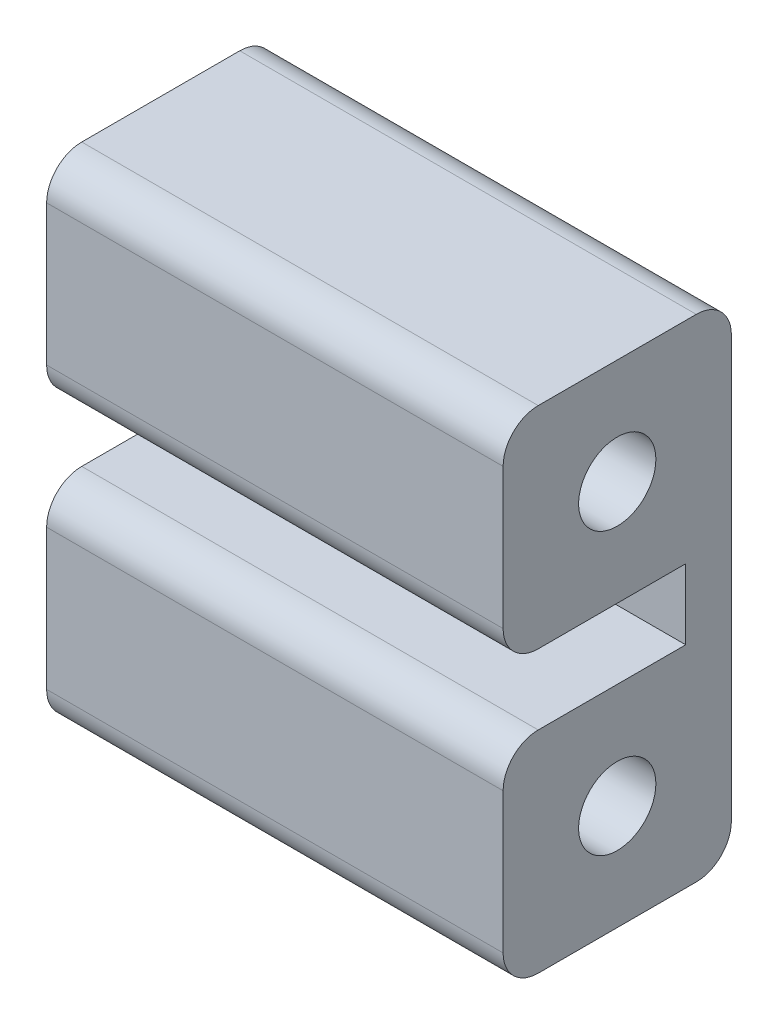
ISO-10303-21;
HEADER;
FILE_DESCRIPTION(('STEP AP214'),'2;1');
FILE_NAME('part.step','',(''),(''),'','','');
FILE_SCHEMA(('AUTOMOTIVE_DESIGN { 1 0 10303 214 1 1 1 1 }'));
ENDSEC;
DATA;
#1=APPLICATION_CONTEXT('core data for automotive mechanical design processes');
#2=APPLICATION_PROTOCOL_DEFINITION('international standard','automotive_design',2000,#1);
#3=PRODUCT_CONTEXT('',#1,'mechanical');
#4=PRODUCT('Part','Part','',(#3));
#5=PRODUCT_RELATED_PRODUCT_CATEGORY('part','',(#4));
#6=PRODUCT_DEFINITION_FORMATION('','',#4);
#7=PRODUCT_DEFINITION_CONTEXT('part definition',#1,'design');
#8=PRODUCT_DEFINITION('design','',#6,#7);
#9=PRODUCT_DEFINITION_SHAPE('','',#8);
#10=(LENGTH_UNIT() NAMED_UNIT(*) SI_UNIT(.MILLI.,.METRE.));
#11=(NAMED_UNIT(*) PLANE_ANGLE_UNIT() SI_UNIT($,.RADIAN.));
#12=(NAMED_UNIT(*) SI_UNIT($,.STERADIAN.) SOLID_ANGLE_UNIT());
#13=UNCERTAINTY_MEASURE_WITH_UNIT(LENGTH_MEASURE(1.E-05),#10,'distance_accuracy_value','');
#14=(GEOMETRIC_REPRESENTATION_CONTEXT(3) GLOBAL_UNCERTAINTY_ASSIGNED_CONTEXT((#13)) GLOBAL_UNIT_ASSIGNED_CONTEXT((#10,
#11,#12)) REPRESENTATION_CONTEXT('',''));
#15=CARTESIAN_POINT('',(0.,0.,0.));
#16=DIRECTION('',(0.,0.,1.));
#17=DIRECTION('',(1.,0.,0.));
#18=AXIS2_PLACEMENT_3D('',#15,#16,#17);
#19=CARTESIAN_POINT('',(-13.,1.,0.));
#20=DIRECTION('',(0.,-1.,0.));
#21=DIRECTION('',(0.,0.,-1.));
#22=AXIS2_PLACEMENT_3D('',#19,#20,#21);
#23=PLANE('',#22);
#24=DIRECTION('',(0.,0.,-1.));
#25=VECTOR('',#24,1.);
#26=CARTESIAN_POINT('',(0.,1.,0.));
#27=LINE('',#26,#25);
#28=CARTESIAN_POINT('',(0.,1.,2.25));
#29=VERTEX_POINT('',#28);
#30=CARTESIAN_POINT('',(0.,1.,-1.95));
#31=VERTEX_POINT('',#30);
#32=EDGE_CURVE('E183',#29,#31,#27,.T.);
#33=ORIENTED_EDGE('',*,*,#32,.F.);
#34=DIRECTION('',(1.,0.,0.));
#35=VECTOR('',#34,1.);
#36=CARTESIAN_POINT('',(-13.,1.,2.25));
#37=LINE('',#36,#35);
#38=CARTESIAN_POINT('',(-13.,1.,2.25));
#39=VERTEX_POINT('',#38);
#40=EDGE_CURVE('E44',#29,#39,#37,.F.);
#41=ORIENTED_EDGE('',*,*,#40,.T.);
#42=DIRECTION('',(0.,0.,-1.));
#43=VECTOR('',#42,1.);
#44=CARTESIAN_POINT('',(-13.,1.,0.));
#45=LINE('',#44,#43);
#46=CARTESIAN_POINT('',(-13.,1.,-1.95));
#47=VERTEX_POINT('',#46);
#48=EDGE_CURVE('E138',#39,#47,#45,.T.);
#49=ORIENTED_EDGE('',*,*,#48,.T.);
#50=DIRECTION('',(1.,0.,0.));
#51=VECTOR('',#50,1.);
#52=CARTESIAN_POINT('',(-13.,1.,-1.95));
#53=LINE('',#52,#51);
#54=EDGE_CURVE('E141',#47,#31,#53,.T.);
#55=ORIENTED_EDGE('',*,*,#54,.T.);
#56=EDGE_LOOP('',(#33,#41,#49,#55));
#57=FACE_BOUND('',#56,.T.);
#58=ADVANCED_FACE('F36',(#57),#23,.T.);
#59=CARTESIAN_POINT('',(-13.,0.,3.25));
#60=DIRECTION('',(0.,0.,1.));
#61=DIRECTION('',(1.,0.,0.));
#62=AXIS2_PLACEMENT_3D('',#59,#60,#61);
#63=PLANE('',#62);
#64=DIRECTION('',(0.,-1.,0.));
#65=VECTOR('',#64,1.);
#66=CARTESIAN_POINT('',(0.,0.,3.25));
#67=LINE('',#66,#65);
#68=CARTESIAN_POINT('',(0.,6.,3.25));
#69=VERTEX_POINT('',#68);
#70=CARTESIAN_POINT('',(0.,2.,3.25));
#71=VERTEX_POINT('',#70);
#72=EDGE_CURVE('E189',#69,#71,#67,.T.);
#73=ORIENTED_EDGE('',*,*,#72,.F.);
#74=DIRECTION('',(1.,0.,0.));
#75=VECTOR('',#74,1.);
#76=CARTESIAN_POINT('',(-13.,6.,3.25));
#77=LINE('',#76,#75);
#78=CARTESIAN_POINT('',(-13.,6.,3.25));
#79=VERTEX_POINT('',#78);
#80=EDGE_CURVE('E227',#69,#79,#77,.F.);
#81=ORIENTED_EDGE('',*,*,#80,.T.);
#82=DIRECTION('',(0.,-1.,0.));
#83=VECTOR('',#82,1.);
#84=CARTESIAN_POINT('',(-13.,0.,3.25));
#85=LINE('',#84,#83);
#86=CARTESIAN_POINT('',(-13.,2.,3.25));
#87=VERTEX_POINT('',#86);
#88=EDGE_CURVE('E169',#79,#87,#85,.T.);
#89=ORIENTED_EDGE('',*,*,#88,.T.);
#90=DIRECTION('',(1.,0.,0.));
#91=VECTOR('',#90,1.);
#92=CARTESIAN_POINT('',(-13.,2.,3.25));
#93=LINE('',#92,#91);
#94=EDGE_CURVE('E224',#87,#71,#93,.T.);
#95=ORIENTED_EDGE('',*,*,#94,.T.);
#96=EDGE_LOOP('',(#73,#81,#89,#95));
#97=FACE_BOUND('',#96,.T.);
#98=ADVANCED_FACE('F277',(#97),#63,.T.);
#99=CARTESIAN_POINT('',(-13.,7.,0.));
#100=DIRECTION('',(0.,-1.,0.));
#101=DIRECTION('',(0.,0.,-1.));
#102=AXIS2_PLACEMENT_3D('',#99,#100,#101);
#103=PLANE('',#102);
#104=DIRECTION('',(0.,0.,-1.));
#105=VECTOR('',#104,1.);
#106=CARTESIAN_POINT('',(-13.,7.,0.));
#107=LINE('',#106,#105);
#108=CARTESIAN_POINT('',(-13.,7.,2.25));
#109=VERTEX_POINT('',#108);
#110=CARTESIAN_POINT('',(-13.,7.,-2.25));
#111=VERTEX_POINT('',#110);
#112=EDGE_CURVE('E175',#109,#111,#107,.T.);
#113=ORIENTED_EDGE('',*,*,#112,.F.);
#114=DIRECTION('',(1.,0.,0.));
#115=VECTOR('',#114,1.);
#116=CARTESIAN_POINT('',(0.,7.,2.25));
#117=LINE('',#116,#115);
#118=CARTESIAN_POINT('',(0.,7.,2.25));
#119=VERTEX_POINT('',#118);
#120=EDGE_CURVE('E209',#109,#119,#117,.T.);
#121=ORIENTED_EDGE('',*,*,#120,.T.);
#122=DIRECTION('',(0.,0.,-1.));
#123=VECTOR('',#122,1.);
#124=CARTESIAN_POINT('',(0.,7.,0.));
#125=LINE('',#124,#123);
#126=CARTESIAN_POINT('',(0.,7.,-2.25));
#127=VERTEX_POINT('',#126);
#128=EDGE_CURVE('E193',#119,#127,#125,.T.);
#129=ORIENTED_EDGE('',*,*,#128,.T.);
#130=DIRECTION('',(1.,0.,0.));
#131=VECTOR('',#130,1.);
#132=CARTESIAN_POINT('',(-13.,7.,-2.25));
#133=LINE('',#132,#131);
#134=EDGE_CURVE('E206',#127,#111,#133,.F.);
#135=ORIENTED_EDGE('',*,*,#134,.T.);
#136=EDGE_LOOP('',(#113,#121,#129,#135));
#137=FACE_BOUND('',#136,.T.);
#138=ADVANCED_FACE('F285',(#137),#103,.F.);
#139=CARTESIAN_POINT('',(-13.,0.,-3.25));
#140=DIRECTION('',(0.,0.,1.));
#141=DIRECTION('',(0.,-1.,0.));
#142=AXIS2_PLACEMENT_3D('',#139,#140,#141);
#143=PLANE('',#142);
#144=DIRECTION('',(0.,-1.,0.));
#145=VECTOR('',#144,1.);
#146=CARTESIAN_POINT('',(-13.,0.,-3.25));
#147=LINE('',#146,#145);
#148=CARTESIAN_POINT('',(-13.,6.,-3.25));
#149=VERTEX_POINT('',#148);
#150=CARTESIAN_POINT('',(-13.,-6.,-3.25));
#151=VERTEX_POINT('',#150);
#152=EDGE_CURVE('E172',#149,#151,#147,.T.);
#153=ORIENTED_EDGE('',*,*,#152,.F.);
#154=DIRECTION('',(1.,0.,0.));
#155=VECTOR('',#154,1.);
#156=CARTESIAN_POINT('',(-13.,6.,-3.25));
#157=LINE('',#156,#155);
#158=CARTESIAN_POINT('',(0.,6.,-3.25));
#159=VERTEX_POINT('',#158);
#160=EDGE_CURVE('E241',#149,#159,#157,.T.);
#161=ORIENTED_EDGE('',*,*,#160,.T.);
#162=DIRECTION('',(0.,-1.,0.));
#163=VECTOR('',#162,1.);
#164=CARTESIAN_POINT('',(0.,0.,-3.25));
#165=LINE('',#164,#163);
#166=CARTESIAN_POINT('',(0.,-6.,-3.25));
#167=VERTEX_POINT('',#166);
#168=EDGE_CURVE('E197',#159,#167,#165,.T.);
#169=ORIENTED_EDGE('',*,*,#168,.T.);
#170=DIRECTION('',(1.,0.,0.));
#171=VECTOR('',#170,1.);
#172=CARTESIAN_POINT('',(-13.,-6.,-3.25));
#173=LINE('',#172,#171);
#174=EDGE_CURVE('E239',#167,#151,#173,.F.);
#175=ORIENTED_EDGE('',*,*,#174,.T.);
#176=EDGE_LOOP('',(#153,#161,#169,#175));
#177=FACE_BOUND('',#176,.T.);
#178=ADVANCED_FACE('F293',(#177),#143,.F.);
#179=CARTESIAN_POINT('',(-13.,-7.,0.));
#180=DIRECTION('',(0.,-1.,0.));
#181=DIRECTION('',(0.,0.,-1.));
#182=AXIS2_PLACEMENT_3D('',#179,#180,#181);
#183=PLANE('',#182);
#184=DIRECTION('',(0.,0.,-1.));
#185=VECTOR('',#184,1.);
#186=CARTESIAN_POINT('',(-13.,-7.,0.));
#187=LINE('',#186,#185);
#188=CARTESIAN_POINT('',(-13.,-7.,2.25));
#189=VERTEX_POINT('',#188);
#190=CARTESIAN_POINT('',(-13.,-7.,-2.25));
#191=VERTEX_POINT('',#190);
#192=EDGE_CURVE('E168',#189,#191,#187,.T.);
#193=ORIENTED_EDGE('',*,*,#192,.T.);
#194=DIRECTION('',(1.,0.,0.));
#195=VECTOR('',#194,1.);
#196=CARTESIAN_POINT('',(0.,-7.,-2.25));
#197=LINE('',#196,#195);
#198=CARTESIAN_POINT('',(0.,-7.,-2.25));
#199=VERTEX_POINT('',#198);
#200=EDGE_CURVE('E246',#191,#199,#197,.T.);
#201=ORIENTED_EDGE('',*,*,#200,.T.);
#202=DIRECTION('',(0.,0.,-1.));
#203=VECTOR('',#202,1.);
#204=CARTESIAN_POINT('',(0.,-7.,0.));
#205=LINE('',#204,#203);
#206=CARTESIAN_POINT('',(0.,-7.,2.25));
#207=VERTEX_POINT('',#206);
#208=EDGE_CURVE('E194',#207,#199,#205,.T.);
#209=ORIENTED_EDGE('',*,*,#208,.F.);
#210=DIRECTION('',(1.,0.,0.));
#211=VECTOR('',#210,1.);
#212=CARTESIAN_POINT('',(-13.,-7.,2.25));
#213=LINE('',#212,#211);
#214=EDGE_CURVE('E244',#207,#189,#213,.F.);
#215=ORIENTED_EDGE('',*,*,#214,.T.);
#216=EDGE_LOOP('',(#193,#201,#209,#215));
#217=FACE_BOUND('',#216,.T.);
#218=ADVANCED_FACE('F300',(#217),#183,.T.);
#219=CARTESIAN_POINT('',(-13.,-2.,3.25));
#220=VERTEX_POINT('',#219);
#221=CARTESIAN_POINT('',(-13.,-6.,3.25));
#222=VERTEX_POINT('',#221);
#223=EDGE_CURVE('E164',#220,#222,#85,.T.);
#224=ORIENTED_EDGE('',*,*,#223,.T.);
#225=DIRECTION('',(1.,0.,0.));
#226=VECTOR('',#225,1.);
#227=CARTESIAN_POINT('',(-13.,-6.,3.25));
#228=LINE('',#227,#226);
#229=CARTESIAN_POINT('',(0.,-6.,3.25));
#230=VERTEX_POINT('',#229);
#231=EDGE_CURVE('E251',#222,#230,#228,.T.);
#232=ORIENTED_EDGE('',*,*,#231,.T.);
#233=CARTESIAN_POINT('',(0.,-2.,3.25));
#234=VERTEX_POINT('',#233);
#235=EDGE_CURVE('E188',#234,#230,#67,.T.);
#236=ORIENTED_EDGE('',*,*,#235,.F.);
#237=DIRECTION('',(1.,0.,0.));
#238=VECTOR('',#237,1.);
#239=CARTESIAN_POINT('',(-13.,-2.,3.25));
#240=LINE('',#239,#238);
#241=EDGE_CURVE('E249',#234,#220,#240,.F.);
#242=ORIENTED_EDGE('',*,*,#241,.T.);
#243=EDGE_LOOP('',(#224,#232,#236,#242));
#244=FACE_BOUND('',#243,.T.);
#245=ADVANCED_FACE('F257',(#244),#63,.T.);
#246=CARTESIAN_POINT('',(-13.,-1.,0.));
#247=DIRECTION('',(0.,-1.,0.));
#248=DIRECTION('',(0.,0.,-1.));
#249=AXIS2_PLACEMENT_3D('',#246,#247,#248);
#250=PLANE('',#249);
#251=DIRECTION('',(0.,0.,-1.));
#252=VECTOR('',#251,1.);
#253=CARTESIAN_POINT('',(-13.,-1.,0.));
#254=LINE('',#253,#252);
#255=CARTESIAN_POINT('',(-13.,-1.,2.25));
#256=VERTEX_POINT('',#255);
#257=CARTESIAN_POINT('',(-13.,-1.,-1.95));
#258=VERTEX_POINT('',#257);
#259=EDGE_CURVE('E161',#256,#258,#254,.T.);
#260=ORIENTED_EDGE('',*,*,#259,.F.);
#261=DIRECTION('',(1.,0.,0.));
#262=VECTOR('',#261,1.);
#263=CARTESIAN_POINT('',(0.,-1.,2.25));
#264=LINE('',#263,#262);
#265=CARTESIAN_POINT('',(0.,-1.,2.25));
#266=VERTEX_POINT('',#265);
#267=EDGE_CURVE('E11',#256,#266,#264,.T.);
#268=ORIENTED_EDGE('',*,*,#267,.T.);
#269=DIRECTION('',(0.,0.,-1.));
#270=VECTOR('',#269,1.);
#271=CARTESIAN_POINT('',(0.,-1.,0.));
#272=LINE('',#271,#270);
#273=CARTESIAN_POINT('',(0.,-1.,-1.95));
#274=VERTEX_POINT('',#273);
#275=EDGE_CURVE('E186',#266,#274,#272,.T.);
#276=ORIENTED_EDGE('',*,*,#275,.T.);
#277=DIRECTION('',(1.,0.,0.));
#278=VECTOR('',#277,1.);
#279=CARTESIAN_POINT('',(-13.,-1.,-1.95));
#280=LINE('',#279,#278);
#281=EDGE_CURVE('E155',#258,#274,#280,.T.);
#282=ORIENTED_EDGE('',*,*,#281,.F.);
#283=EDGE_LOOP('',(#260,#268,#276,#282));
#284=FACE_BOUND('',#283,.T.);
#285=ADVANCED_FACE('F269',(#284),#250,.F.);
#286=CARTESIAN_POINT('',(-13.,4.,0.));
#287=DIRECTION('',(1.,0.,0.));
#288=DIRECTION('',(0.,0.,-1.));
#289=AXIS2_PLACEMENT_3D('',#286,#287,#288);
#290=CYLINDRICAL_SURFACE('',#289,1.1);
#291=CARTESIAN_POINT('',(-13.,4.,0.));
#292=DIRECTION('',(1.,0.,0.));
#293=DIRECTION('',(0.,0.,-1.));
#294=AXIS2_PLACEMENT_3D('',#291,#292,#293);
#295=CIRCLE('',#294,1.1);
#296=CARTESIAN_POINT('',(-13.,4.,-1.1));
#297=VERTEX_POINT('',#296);
#298=EDGE_CURVE('E178',#297,#297,#295,.T.);
#299=ORIENTED_EDGE('',*,*,#298,.F.);
#300=EDGE_LOOP('',(#299));
#301=FACE_BOUND('',#300,.T.);
#302=CARTESIAN_POINT('',(0.,4.,0.));
#303=DIRECTION('',(1.,0.,0.));
#304=DIRECTION('',(0.,0.,-1.));
#305=AXIS2_PLACEMENT_3D('',#302,#303,#304);
#306=CIRCLE('',#305,1.1);
#307=CARTESIAN_POINT('',(0.,4.,-1.1));
#308=VERTEX_POINT('',#307);
#309=EDGE_CURVE('E192',#308,#308,#306,.T.);
#310=ORIENTED_EDGE('',*,*,#309,.T.);
#311=EDGE_LOOP('',(#310));
#312=FACE_BOUND('',#311,.T.);
#313=ADVANCED_FACE('F387',(#301,#312),#290,.F.);
#314=CARTESIAN_POINT('',(-13.,0.,-1.95));
#315=DIRECTION('',(0.,0.,1.));
#316=DIRECTION('',(1.,0.,0.));
#317=AXIS2_PLACEMENT_3D('',#314,#315,#316);
#318=PLANE('',#317);
#319=DIRECTION('',(0.,-1.,0.));
#320=VECTOR('',#319,1.);
#321=CARTESIAN_POINT('',(0.,0.,-1.95));
#322=LINE('',#321,#320);
#323=EDGE_CURVE('E154',#31,#274,#322,.T.);
#324=ORIENTED_EDGE('',*,*,#323,.F.);
#325=ORIENTED_EDGE('',*,*,#54,.F.);
#326=DIRECTION('',(0.,-1.,0.));
#327=VECTOR('',#326,1.);
#328=CARTESIAN_POINT('',(-13.,0.,-1.95));
#329=LINE('',#328,#327);
#330=EDGE_CURVE('E146',#47,#258,#329,.T.);
#331=ORIENTED_EDGE('',*,*,#330,.T.);
#332=ORIENTED_EDGE('',*,*,#281,.T.);
#333=EDGE_LOOP('',(#324,#325,#331,#332));
#334=FACE_BOUND('',#333,.T.);
#335=ADVANCED_FACE('F151',(#334),#318,.T.);
#336=CARTESIAN_POINT('',(-13.,-4.,0.));
#337=DIRECTION('',(1.,0.,0.));
#338=DIRECTION('',(0.,0.,-1.));
#339=AXIS2_PLACEMENT_3D('',#336,#337,#338);
#340=CYLINDRICAL_SURFACE('',#339,1.1);
#341=CARTESIAN_POINT('',(-13.,-4.,0.));
#342=DIRECTION('',(1.,0.,0.));
#343=DIRECTION('',(0.,0.,-1.));
#344=AXIS2_PLACEMENT_3D('',#341,#342,#343);
#345=CIRCLE('',#344,1.1);
#346=CARTESIAN_POINT('',(-13.,-4.,-1.1));
#347=VERTEX_POINT('',#346);
#348=EDGE_CURVE('E156',#347,#347,#345,.F.);
#349=ORIENTED_EDGE('',*,*,#348,.T.);
#350=EDGE_LOOP('',(#349));
#351=FACE_BOUND('',#350,.T.);
#352=CARTESIAN_POINT('',(0.,-4.,0.));
#353=DIRECTION('',(1.,0.,0.));
#354=DIRECTION('',(0.,0.,-1.));
#355=AXIS2_PLACEMENT_3D('',#352,#353,#354);
#356=CIRCLE('',#355,1.1);
#357=CARTESIAN_POINT('',(0.,-4.,-1.1));
#358=VERTEX_POINT('',#357);
#359=EDGE_CURVE('E147',#358,#358,#356,.F.);
#360=ORIENTED_EDGE('',*,*,#359,.F.);
#361=EDGE_LOOP('',(#360));
#362=FACE_BOUND('',#361,.T.);
#363=ADVANCED_FACE('F370',(#351,#362),#340,.F.);
#364=CARTESIAN_POINT('',(-13.,0.,0.));
#365=DIRECTION('',(1.,0.,0.));
#366=DIRECTION('',(0.,0.,-1.));
#367=AXIS2_PLACEMENT_3D('',#364,#365,#366);
#368=PLANE('',#367);
#369=ORIENTED_EDGE('',*,*,#88,.F.);
#370=CARTESIAN_POINT('',(-13.,6.,2.25));
#371=DIRECTION('',(1.,0.,0.));
#372=DIRECTION('',(0.,0.,-1.));
#373=AXIS2_PLACEMENT_3D('',#370,#371,#372);
#374=CIRCLE('',#373,1.);
#375=EDGE_CURVE('E237',#79,#109,#374,.F.);
#376=ORIENTED_EDGE('',*,*,#375,.T.);
#377=ORIENTED_EDGE('',*,*,#112,.T.);
#378=CARTESIAN_POINT('',(-13.,6.,-2.25));
#379=DIRECTION('',(1.,0.,0.));
#380=DIRECTION('',(0.,0.,-1.));
#381=AXIS2_PLACEMENT_3D('',#378,#379,#380);
#382=CIRCLE('',#381,1.);
#383=EDGE_CURVE('E235',#111,#149,#382,.F.);
#384=ORIENTED_EDGE('',*,*,#383,.T.);
#385=ORIENTED_EDGE('',*,*,#152,.T.);
#386=CARTESIAN_POINT('',(-13.,-6.,-2.25));
#387=DIRECTION('',(1.,0.,0.));
#388=DIRECTION('',(0.,0.,-1.));
#389=AXIS2_PLACEMENT_3D('',#386,#387,#388);
#390=CIRCLE('',#389,1.);
#391=EDGE_CURVE('E233',#151,#191,#390,.F.);
#392=ORIENTED_EDGE('',*,*,#391,.T.);
#393=ORIENTED_EDGE('',*,*,#192,.F.);
#394=CARTESIAN_POINT('',(-13.,-6.,2.25));
#395=DIRECTION('',(1.,0.,0.));
#396=DIRECTION('',(0.,0.,-1.));
#397=AXIS2_PLACEMENT_3D('',#394,#395,#396);
#398=CIRCLE('',#397,1.);
#399=EDGE_CURVE('E57',#189,#222,#398,.F.);
#400=ORIENTED_EDGE('',*,*,#399,.T.);
#401=ORIENTED_EDGE('',*,*,#223,.F.);
#402=CARTESIAN_POINT('',(-13.,-2.,2.25));
#403=DIRECTION('',(1.,0.,0.));
#404=DIRECTION('',(0.,0.,-1.));
#405=AXIS2_PLACEMENT_3D('',#402,#403,#404);
#406=CIRCLE('',#405,1.);
#407=EDGE_CURVE('E51',#220,#256,#406,.F.);
#408=ORIENTED_EDGE('',*,*,#407,.T.);
#409=ORIENTED_EDGE('',*,*,#259,.T.);
#410=ORIENTED_EDGE('',*,*,#330,.F.);
#411=ORIENTED_EDGE('',*,*,#48,.F.);
#412=CARTESIAN_POINT('',(-13.,2.,2.25));
#413=DIRECTION('',(1.,0.,0.));
#414=DIRECTION('',(0.,0.,-1.));
#415=AXIS2_PLACEMENT_3D('',#412,#413,#414);
#416=CIRCLE('',#415,1.);
#417=EDGE_CURVE('E230',#39,#87,#416,.F.);
#418=ORIENTED_EDGE('',*,*,#417,.T.);
#419=EDGE_LOOP('',(#369,#376,#377,#384,#385,#392,#393,#400,#401,#408,#409,#410,#411,#418));
#420=FACE_BOUND('',#419,.T.);
#421=ORIENTED_EDGE('',*,*,#298,.T.);
#422=EDGE_LOOP('',(#421));
#423=FACE_BOUND('',#422,.T.);
#424=ORIENTED_EDGE('',*,*,#348,.F.);
#425=EDGE_LOOP('',(#424));
#426=FACE_BOUND('',#425,.T.);
#427=ADVANCED_FACE('F159',(#420,#423,#426),#368,.F.);
#428=CARTESIAN_POINT('',(0.,0.,0.));
#429=DIRECTION('',(1.,0.,0.));
#430=DIRECTION('',(0.,0.,-1.));
#431=AXIS2_PLACEMENT_3D('',#428,#429,#430);
#432=PLANE('',#431);
#433=ORIENTED_EDGE('',*,*,#128,.F.);
#434=CARTESIAN_POINT('',(0.,6.,2.25));
#435=DIRECTION('',(1.,0.,0.));
#436=DIRECTION('',(0.,0.,-1.));
#437=AXIS2_PLACEMENT_3D('',#434,#435,#436);
#438=CIRCLE('',#437,1.);
#439=EDGE_CURVE('E222',#119,#69,#438,.T.);
#440=ORIENTED_EDGE('',*,*,#439,.T.);
#441=ORIENTED_EDGE('',*,*,#72,.T.);
#442=CARTESIAN_POINT('',(0.,2.,2.25));
#443=DIRECTION('',(1.,0.,0.));
#444=DIRECTION('',(0.,0.,-1.));
#445=AXIS2_PLACEMENT_3D('',#442,#443,#444);
#446=CIRCLE('',#445,1.);
#447=EDGE_CURVE('E214',#71,#29,#446,.T.);
#448=ORIENTED_EDGE('',*,*,#447,.T.);
#449=ORIENTED_EDGE('',*,*,#32,.T.);
#450=ORIENTED_EDGE('',*,*,#323,.T.);
#451=ORIENTED_EDGE('',*,*,#275,.F.);
#452=CARTESIAN_POINT('',(0.,-2.,2.25));
#453=DIRECTION('',(1.,0.,0.));
#454=DIRECTION('',(0.,0.,-1.));
#455=AXIS2_PLACEMENT_3D('',#452,#453,#454);
#456=CIRCLE('',#455,1.);
#457=EDGE_CURVE('E212',#266,#234,#456,.T.);
#458=ORIENTED_EDGE('',*,*,#457,.T.);
#459=ORIENTED_EDGE('',*,*,#235,.T.);
#460=CARTESIAN_POINT('',(0.,-6.,2.25));
#461=DIRECTION('',(1.,0.,0.));
#462=DIRECTION('',(0.,0.,-1.));
#463=AXIS2_PLACEMENT_3D('',#460,#461,#462);
#464=CIRCLE('',#463,1.);
#465=EDGE_CURVE('E216',#230,#207,#464,.T.);
#466=ORIENTED_EDGE('',*,*,#465,.T.);
#467=ORIENTED_EDGE('',*,*,#208,.T.);
#468=CARTESIAN_POINT('',(0.,-6.,-2.25));
#469=DIRECTION('',(1.,0.,0.));
#470=DIRECTION('',(0.,0.,-1.));
#471=AXIS2_PLACEMENT_3D('',#468,#469,#470);
#472=CIRCLE('',#471,1.);
#473=EDGE_CURVE('E218',#199,#167,#472,.T.);
#474=ORIENTED_EDGE('',*,*,#473,.T.);
#475=ORIENTED_EDGE('',*,*,#168,.F.);
#476=CARTESIAN_POINT('',(0.,6.,-2.25));
#477=DIRECTION('',(1.,0.,0.));
#478=DIRECTION('',(0.,0.,-1.));
#479=AXIS2_PLACEMENT_3D('',#476,#477,#478);
#480=CIRCLE('',#479,1.);
#481=EDGE_CURVE('E220',#159,#127,#480,.T.);
#482=ORIENTED_EDGE('',*,*,#481,.T.);
#483=EDGE_LOOP('',(#433,#440,#441,#448,#449,#450,#451,#458,#459,#466,#467,#474,#475,#482));
#484=FACE_BOUND('',#483,.T.);
#485=ORIENTED_EDGE('',*,*,#309,.F.);
#486=EDGE_LOOP('',(#485));
#487=FACE_BOUND('',#486,.T.);
#488=ORIENTED_EDGE('',*,*,#359,.T.);
#489=EDGE_LOOP('',(#488));
#490=FACE_BOUND('',#489,.T.);
#491=ADVANCED_FACE('F262',(#484,#487,#490),#432,.T.);
#492=CARTESIAN_POINT('',(-13.,6.,2.25));
#493=DIRECTION('',(-1.,0.,0.));
#494=DIRECTION('',(0.,0.,1.));
#495=AXIS2_PLACEMENT_3D('',#492,#493,#494);
#496=CYLINDRICAL_SURFACE('',#495,1.);
#497=ORIENTED_EDGE('',*,*,#375,.F.);
#498=ORIENTED_EDGE('',*,*,#80,.F.);
#499=ORIENTED_EDGE('',*,*,#439,.F.);
#500=ORIENTED_EDGE('',*,*,#120,.F.);
#501=EDGE_LOOP('',(#497,#498,#499,#500));
#502=FACE_BOUND('',#501,.T.);
#503=ADVANCED_FACE('F280',(#502),#496,.T.);
#504=CARTESIAN_POINT('',(-13.,6.,-2.25));
#505=DIRECTION('',(1.,0.,0.));
#506=DIRECTION('',(0.,0.,-1.));
#507=AXIS2_PLACEMENT_3D('',#504,#505,#506);
#508=CYLINDRICAL_SURFACE('',#507,1.);
#509=ORIENTED_EDGE('',*,*,#383,.F.);
#510=ORIENTED_EDGE('',*,*,#134,.F.);
#511=ORIENTED_EDGE('',*,*,#481,.F.);
#512=ORIENTED_EDGE('',*,*,#160,.F.);
#513=EDGE_LOOP('',(#509,#510,#511,#512));
#514=FACE_BOUND('',#513,.T.);
#515=ADVANCED_FACE('F288',(#514),#508,.T.);
#516=CARTESIAN_POINT('',(-13.,-6.,-2.25));
#517=DIRECTION('',(-1.,0.,0.));
#518=DIRECTION('',(0.,0.,1.));
#519=AXIS2_PLACEMENT_3D('',#516,#517,#518);
#520=CYLINDRICAL_SURFACE('',#519,1.);
#521=ORIENTED_EDGE('',*,*,#391,.F.);
#522=ORIENTED_EDGE('',*,*,#174,.F.);
#523=ORIENTED_EDGE('',*,*,#473,.F.);
#524=ORIENTED_EDGE('',*,*,#200,.F.);
#525=EDGE_LOOP('',(#521,#522,#523,#524));
#526=FACE_BOUND('',#525,.T.);
#527=ADVANCED_FACE('F297',(#526),#520,.T.);
#528=CARTESIAN_POINT('',(-13.,-6.,2.25));
#529=DIRECTION('',(1.,0.,0.));
#530=DIRECTION('',(0.,0.,-1.));
#531=AXIS2_PLACEMENT_3D('',#528,#529,#530);
#532=CYLINDRICAL_SURFACE('',#531,1.);
#533=ORIENTED_EDGE('',*,*,#399,.F.);
#534=ORIENTED_EDGE('',*,*,#214,.F.);
#535=ORIENTED_EDGE('',*,*,#465,.F.);
#536=ORIENTED_EDGE('',*,*,#231,.F.);
#537=EDGE_LOOP('',(#533,#534,#535,#536));
#538=FACE_BOUND('',#537,.T.);
#539=ADVANCED_FACE('F302',(#538),#532,.T.);
#540=CARTESIAN_POINT('',(-13.,2.,2.25));
#541=DIRECTION('',(1.,0.,0.));
#542=DIRECTION('',(0.,0.,-1.));
#543=AXIS2_PLACEMENT_3D('',#540,#541,#542);
#544=CYLINDRICAL_SURFACE('',#543,1.);
#545=ORIENTED_EDGE('',*,*,#417,.F.);
#546=ORIENTED_EDGE('',*,*,#40,.F.);
#547=ORIENTED_EDGE('',*,*,#447,.F.);
#548=ORIENTED_EDGE('',*,*,#94,.F.);
#549=EDGE_LOOP('',(#545,#546,#547,#548));
#550=FACE_BOUND('',#549,.T.);
#551=ADVANCED_FACE('F271',(#550),#544,.T.);
#552=CARTESIAN_POINT('',(-13.,-2.,2.25));
#553=DIRECTION('',(-1.,0.,0.));
#554=DIRECTION('',(0.,0.,1.));
#555=AXIS2_PLACEMENT_3D('',#552,#553,#554);
#556=CYLINDRICAL_SURFACE('',#555,1.);
#557=ORIENTED_EDGE('',*,*,#407,.F.);
#558=ORIENTED_EDGE('',*,*,#241,.F.);
#559=ORIENTED_EDGE('',*,*,#457,.F.);
#560=ORIENTED_EDGE('',*,*,#267,.F.);
#561=EDGE_LOOP('',(#557,#558,#559,#560));
#562=FACE_BOUND('',#561,.T.);
#563=ADVANCED_FACE('F38',(#562),#556,.T.);
#564=CLOSED_SHELL('',(#58,#98,#138,#178,#218,#245,#285,#313,#335,#363,#427,#491,#503,#515,#527,
#539,#551,#563));
#565=MANIFOLD_SOLID_BREP('B2',#564);
#566=ADVANCED_BREP_SHAPE_REPRESENTATION('',(#18,#565),#14);
#567=SHAPE_DEFINITION_REPRESENTATION(#9,#566);
ENDSEC;
END-ISO-10303-21;
